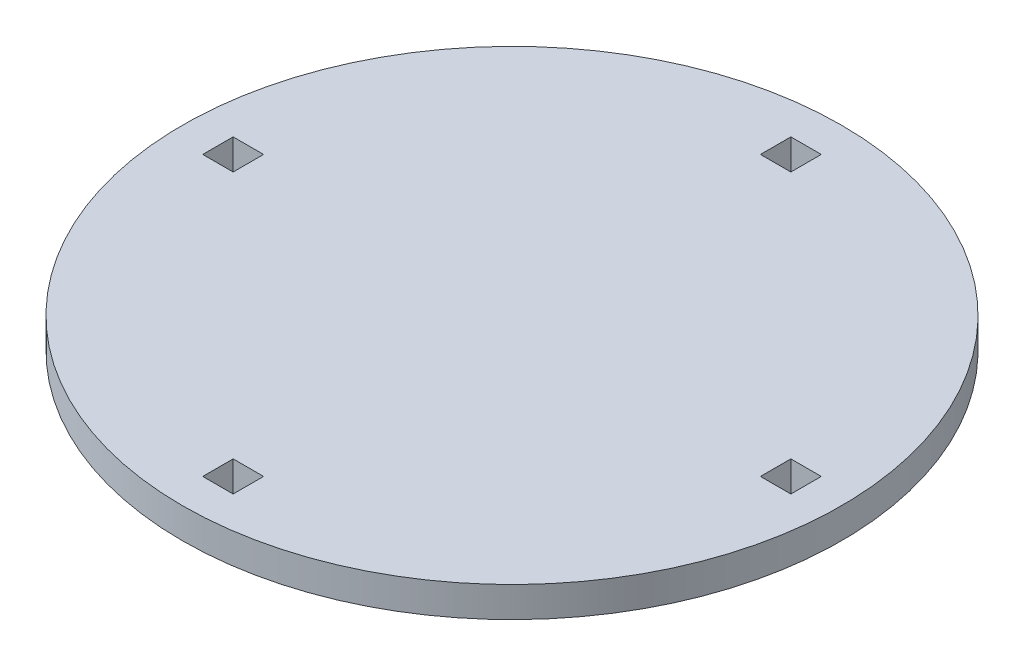
ISO-10303-21;
HEADER;
FILE_DESCRIPTION(('STEP AP214'),'2;1');
FILE_NAME('part.step','',(''),(''),'','','');
FILE_SCHEMA(('AUTOMOTIVE_DESIGN { 1 0 10303 214 1 1 1 1 }'));
ENDSEC;
DATA;
#1=APPLICATION_CONTEXT('core data for automotive mechanical design processes');
#2=APPLICATION_PROTOCOL_DEFINITION('international standard','automotive_design',2000,#1);
#3=PRODUCT_CONTEXT('',#1,'mechanical');
#4=PRODUCT('Part','Part','',(#3));
#5=PRODUCT_RELATED_PRODUCT_CATEGORY('part','',(#4));
#6=PRODUCT_DEFINITION_FORMATION('','',#4);
#7=PRODUCT_DEFINITION_CONTEXT('part definition',#1,'design');
#8=PRODUCT_DEFINITION('design','',#6,#7);
#9=PRODUCT_DEFINITION_SHAPE('','',#8);
#10=(LENGTH_UNIT() NAMED_UNIT(*) SI_UNIT(.MILLI.,.METRE.));
#11=(NAMED_UNIT(*) PLANE_ANGLE_UNIT() SI_UNIT($,.RADIAN.));
#12=(NAMED_UNIT(*) SI_UNIT($,.STERADIAN.) SOLID_ANGLE_UNIT());
#13=UNCERTAINTY_MEASURE_WITH_UNIT(LENGTH_MEASURE(1.E-05),#10,'distance_accuracy_value','');
#14=(GEOMETRIC_REPRESENTATION_CONTEXT(3) GLOBAL_UNCERTAINTY_ASSIGNED_CONTEXT((#13)) GLOBAL_UNIT_ASSIGNED_CONTEXT((#10,
#11,#12)) REPRESENTATION_CONTEXT('',''));
#15=CARTESIAN_POINT('',(0.,0.,0.));
#16=DIRECTION('',(0.,0.,1.));
#17=DIRECTION('',(1.,0.,0.));
#18=AXIS2_PLACEMENT_3D('',#15,#16,#17);
#19=CARTESIAN_POINT('',(0.,3.,0.));
#20=DIRECTION('',(0.,1.,0.));
#21=DIRECTION('',(0.,0.,1.));
#22=AXIS2_PLACEMENT_3D('',#19,#20,#21);
#23=PLANE('',#22);
#24=CARTESIAN_POINT('',(0.,3.,0.));
#25=DIRECTION('',(0.,1.,0.));
#26=DIRECTION('',(0.,0.,1.));
#27=AXIS2_PLACEMENT_3D('',#24,#25,#26);
#28=CIRCLE('',#27,32.5);
#29=CARTESIAN_POINT('',(0.,3.,32.5));
#30=VERTEX_POINT('',#29);
#31=EDGE_CURVE('E11',#30,#30,#28,.T.);
#32=ORIENTED_EDGE('',*,*,#31,.T.);
#33=EDGE_LOOP('',(#32));
#34=FACE_BOUND('',#33,.T.);
#35=DIRECTION('',(0.,0.,-1.));
#36=VECTOR('',#35,1.);
#37=CARTESIAN_POINT('',(-28.9999999999969,3.,0.));
#38=LINE('',#37,#36);
#39=CARTESIAN_POINT('',(-28.9999999999969,3.,1.5000000000028));
#40=VERTEX_POINT('',#39);
#41=CARTESIAN_POINT('',(-28.9999999999969,3.,-1.4999999999972));
#42=VERTEX_POINT('',#41);
#43=EDGE_CURVE('E287',#40,#42,#38,.T.);
#44=ORIENTED_EDGE('',*,*,#43,.T.);
#45=DIRECTION('',(1.,0.,0.));
#46=VECTOR('',#45,1.);
#47=CARTESIAN_POINT('',(0.,3.,-1.49999999999721));
#48=LINE('',#47,#46);
#49=CARTESIAN_POINT('',(-25.9999999999969,3.,-1.4999999999972));
#50=VERTEX_POINT('',#49);
#51=EDGE_CURVE('E291',#42,#50,#48,.T.);
#52=ORIENTED_EDGE('',*,*,#51,.T.);
#53=DIRECTION('',(0.,0.,1.));
#54=VECTOR('',#53,1.);
#55=CARTESIAN_POINT('',(-25.9999999999969,3.,0.));
#56=LINE('',#55,#54);
#57=CARTESIAN_POINT('',(-25.9999999999969,3.,1.5000000000028));
#58=VERTEX_POINT('',#57);
#59=EDGE_CURVE('E164',#50,#58,#56,.T.);
#60=ORIENTED_EDGE('',*,*,#59,.T.);
#61=DIRECTION('',(-1.,0.,0.));
#62=VECTOR('',#61,1.);
#63=CARTESIAN_POINT('',(0.,3.,1.50000000000279));
#64=LINE('',#63,#62);
#65=EDGE_CURVE('E283',#58,#40,#64,.T.);
#66=ORIENTED_EDGE('',*,*,#65,.T.);
#67=EDGE_LOOP('',(#44,#52,#60,#66));
#68=FACE_BOUND('',#67,.T.);
#69=DIRECTION('',(-1.,0.,0.));
#70=VECTOR('',#69,1.);
#71=CARTESIAN_POINT('',(0.,3.,28.9999999999997));
#72=LINE('',#71,#70);
#73=CARTESIAN_POINT('',(1.50000000000591,3.,28.9999999999997));
#74=VERTEX_POINT('',#73);
#75=CARTESIAN_POINT('',(-1.49999999999409,3.,28.9999999999997));
#76=VERTEX_POINT('',#75);
#77=EDGE_CURVE('E303',#74,#76,#72,.T.);
#78=ORIENTED_EDGE('',*,*,#77,.T.);
#79=DIRECTION('',(0.,0.,-1.));
#80=VECTOR('',#79,1.);
#81=CARTESIAN_POINT('',(-1.49999999999409,3.,0.));
#82=LINE('',#81,#80);
#83=CARTESIAN_POINT('',(-1.49999999999409,3.,25.9999999999997));
#84=VERTEX_POINT('',#83);
#85=EDGE_CURVE('E307',#76,#84,#82,.T.);
#86=ORIENTED_EDGE('',*,*,#85,.T.);
#87=DIRECTION('',(1.,0.,0.));
#88=VECTOR('',#87,1.);
#89=CARTESIAN_POINT('',(0.,3.,25.9999999999997));
#90=LINE('',#89,#88);
#91=CARTESIAN_POINT('',(1.50000000000591,3.,25.9999999999997));
#92=VERTEX_POINT('',#91);
#93=EDGE_CURVE('E295',#84,#92,#90,.T.);
#94=ORIENTED_EDGE('',*,*,#93,.T.);
#95=DIRECTION('',(0.,0.,1.));
#96=VECTOR('',#95,1.);
#97=CARTESIAN_POINT('',(1.50000000000591,3.,0.));
#98=LINE('',#97,#96);
#99=EDGE_CURVE('E299',#92,#74,#98,.T.);
#100=ORIENTED_EDGE('',*,*,#99,.T.);
#101=EDGE_LOOP('',(#78,#86,#94,#100));
#102=FACE_BOUND('',#101,.T.);
#103=DIRECTION('',(0.,0.,1.));
#104=VECTOR('',#103,1.);
#105=CARTESIAN_POINT('',(29.0000000000028,3.,0.));
#106=LINE('',#105,#104);
#107=CARTESIAN_POINT('',(29.0000000000028,3.,-1.50000000000312));
#108=VERTEX_POINT('',#107);
#109=CARTESIAN_POINT('',(29.0000000000028,3.,1.49999999999688));
#110=VERTEX_POINT('',#109);
#111=EDGE_CURVE('E319',#108,#110,#106,.T.);
#112=ORIENTED_EDGE('',*,*,#111,.T.);
#113=DIRECTION('',(-1.,0.,0.));
#114=VECTOR('',#113,1.);
#115=CARTESIAN_POINT('',(0.,3.,1.49999999999689));
#116=LINE('',#115,#114);
#117=CARTESIAN_POINT('',(26.0000000000028,3.,1.49999999999688));
#118=VERTEX_POINT('',#117);
#119=EDGE_CURVE('E323',#110,#118,#116,.T.);
#120=ORIENTED_EDGE('',*,*,#119,.T.);
#121=DIRECTION('',(0.,0.,-1.));
#122=VECTOR('',#121,1.);
#123=CARTESIAN_POINT('',(26.0000000000028,3.,0.));
#124=LINE('',#123,#122);
#125=CARTESIAN_POINT('',(26.0000000000028,3.,-1.50000000000312));
#126=VERTEX_POINT('',#125);
#127=EDGE_CURVE('E311',#118,#126,#124,.T.);
#128=ORIENTED_EDGE('',*,*,#127,.T.);
#129=DIRECTION('',(1.,0.,0.));
#130=VECTOR('',#129,1.);
#131=CARTESIAN_POINT('',(0.,3.,-1.50000000000311));
#132=LINE('',#131,#130);
#133=EDGE_CURVE('E315',#126,#108,#132,.T.);
#134=ORIENTED_EDGE('',*,*,#133,.T.);
#135=EDGE_LOOP('',(#112,#120,#128,#134));
#136=FACE_BOUND('',#135,.T.);
#137=DIRECTION('',(1.,0.,0.));
#138=VECTOR('',#137,1.);
#139=CARTESIAN_POINT('',(0.,3.,-29.));
#140=LINE('',#139,#138);
#141=CARTESIAN_POINT('',(-1.5,3.,-29.));
#142=VERTEX_POINT('',#141);
#143=CARTESIAN_POINT('',(1.5,3.,-29.));
#144=VERTEX_POINT('',#143);
#145=EDGE_CURVE('E335',#142,#144,#140,.T.);
#146=ORIENTED_EDGE('',*,*,#145,.T.);
#147=DIRECTION('',(0.,0.,1.));
#148=VECTOR('',#147,1.);
#149=CARTESIAN_POINT('',(1.5,3.,0.));
#150=LINE('',#149,#148);
#151=CARTESIAN_POINT('',(1.5,3.,-26.));
#152=VERTEX_POINT('',#151);
#153=EDGE_CURVE('E160',#144,#152,#150,.T.);
#154=ORIENTED_EDGE('',*,*,#153,.T.);
#155=DIRECTION('',(-1.,0.,0.));
#156=VECTOR('',#155,1.);
#157=CARTESIAN_POINT('',(0.,3.,-26.));
#158=LINE('',#157,#156);
#159=CARTESIAN_POINT('',(-1.5,3.,-26.));
#160=VERTEX_POINT('',#159);
#161=EDGE_CURVE('E327',#152,#160,#158,.T.);
#162=ORIENTED_EDGE('',*,*,#161,.T.);
#163=DIRECTION('',(0.,0.,-1.));
#164=VECTOR('',#163,1.);
#165=CARTESIAN_POINT('',(-1.5,3.,0.));
#166=LINE('',#165,#164);
#167=EDGE_CURVE('E331',#160,#142,#166,.T.);
#168=ORIENTED_EDGE('',*,*,#167,.T.);
#169=EDGE_LOOP('',(#146,#154,#162,#168));
#170=FACE_BOUND('',#169,.T.);
#171=ADVANCED_FACE('F39',(#34,#68,#102,#136,#170),#23,.T.);
#172=CARTESIAN_POINT('',(0.,0.,0.));
#173=DIRECTION('',(0.,1.,0.));
#174=DIRECTION('',(0.,0.,1.));
#175=AXIS2_PLACEMENT_3D('',#172,#173,#174);
#176=PLANE('',#175);
#177=DIRECTION('',(1.,0.,0.));
#178=VECTOR('',#177,1.);
#179=CARTESIAN_POINT('',(26.0000000000028,0.,1.49999999999688));
#180=LINE('',#179,#178);
#181=CARTESIAN_POINT('',(26.0000000000028,0.,1.49999999999688));
#182=VERTEX_POINT('',#181);
#183=CARTESIAN_POINT('',(29.0000000000028,0.,1.49999999999688));
#184=VERTEX_POINT('',#183);
#185=EDGE_CURVE('E198',#182,#184,#180,.T.);
#186=ORIENTED_EDGE('',*,*,#185,.T.);
#187=DIRECTION('',(0.,0.,-1.));
#188=VECTOR('',#187,1.);
#189=CARTESIAN_POINT('',(29.0000000000028,0.,-1.50000000000312));
#190=LINE('',#189,#188);
#191=CARTESIAN_POINT('',(29.0000000000028,0.,-1.50000000000312));
#192=VERTEX_POINT('',#191);
#193=EDGE_CURVE('E202',#184,#192,#190,.T.);
#194=ORIENTED_EDGE('',*,*,#193,.T.);
#195=DIRECTION('',(-1.,0.,0.));
#196=VECTOR('',#195,1.);
#197=CARTESIAN_POINT('',(26.0000000000028,0.,-1.50000000000312));
#198=LINE('',#197,#196);
#199=CARTESIAN_POINT('',(26.0000000000028,0.,-1.50000000000312));
#200=VERTEX_POINT('',#199);
#201=EDGE_CURVE('E207',#192,#200,#198,.T.);
#202=ORIENTED_EDGE('',*,*,#201,.T.);
#203=DIRECTION('',(0.,0.,1.));
#204=VECTOR('',#203,1.);
#205=CARTESIAN_POINT('',(26.0000000000028,0.,-1.50000000000312));
#206=LINE('',#205,#204);
#207=EDGE_CURVE('E211',#200,#182,#206,.T.);
#208=ORIENTED_EDGE('',*,*,#207,.T.);
#209=EDGE_LOOP('',(#186,#194,#202,#208));
#210=FACE_BOUND('',#209,.T.);
#211=DIRECTION('',(-1.,0.,0.));
#212=VECTOR('',#211,1.);
#213=CARTESIAN_POINT('',(-25.9999999999969,0.,-1.4999999999972));
#214=LINE('',#213,#212);
#215=CARTESIAN_POINT('',(-25.9999999999969,0.,-1.4999999999972));
#216=VERTEX_POINT('',#215);
#217=CARTESIAN_POINT('',(-28.9999999999969,0.,-1.4999999999972));
#218=VERTEX_POINT('',#217);
#219=EDGE_CURVE('E252',#216,#218,#214,.T.);
#220=ORIENTED_EDGE('',*,*,#219,.T.);
#221=DIRECTION('',(0.,0.,1.));
#222=VECTOR('',#221,1.);
#223=CARTESIAN_POINT('',(-28.9999999999969,0.,1.5000000000028));
#224=LINE('',#223,#222);
#225=CARTESIAN_POINT('',(-28.9999999999969,0.,1.5000000000028));
#226=VERTEX_POINT('',#225);
#227=EDGE_CURVE('E256',#218,#226,#224,.T.);
#228=ORIENTED_EDGE('',*,*,#227,.T.);
#229=DIRECTION('',(1.,0.,0.));
#230=VECTOR('',#229,1.);
#231=CARTESIAN_POINT('',(-25.9999999999969,0.,1.5000000000028));
#232=LINE('',#231,#230);
#233=CARTESIAN_POINT('',(-25.9999999999969,0.,1.5000000000028));
#234=VERTEX_POINT('',#233);
#235=EDGE_CURVE('E260',#226,#234,#232,.T.);
#236=ORIENTED_EDGE('',*,*,#235,.T.);
#237=DIRECTION('',(0.,0.,-1.));
#238=VECTOR('',#237,1.);
#239=CARTESIAN_POINT('',(-25.9999999999969,0.,1.5000000000028));
#240=LINE('',#239,#238);
#241=EDGE_CURVE('E264',#234,#216,#240,.T.);
#242=ORIENTED_EDGE('',*,*,#241,.T.);
#243=EDGE_LOOP('',(#220,#228,#236,#242));
#244=FACE_BOUND('',#243,.T.);
#245=CARTESIAN_POINT('',(0.,0.,0.));
#246=DIRECTION('',(0.,1.,0.));
#247=DIRECTION('',(0.,0.,1.));
#248=AXIS2_PLACEMENT_3D('',#245,#246,#247);
#249=CIRCLE('',#248,32.5);
#250=CARTESIAN_POINT('',(0.,0.,32.5));
#251=VERTEX_POINT('',#250);
#252=EDGE_CURVE('E43',#251,#251,#249,.T.);
#253=ORIENTED_EDGE('',*,*,#252,.F.);
#254=EDGE_LOOP('',(#253));
#255=FACE_BOUND('',#254,.T.);
#256=DIRECTION('',(0.,0.,1.));
#257=VECTOR('',#256,1.);
#258=CARTESIAN_POINT('',(-1.49999999999409,0.,25.9999999999997));
#259=LINE('',#258,#257);
#260=CARTESIAN_POINT('',(-1.49999999999409,0.,25.9999999999997));
#261=VERTEX_POINT('',#260);
#262=CARTESIAN_POINT('',(-1.49999999999409,0.,28.9999999999997));
#263=VERTEX_POINT('',#262);
#264=EDGE_CURVE('E223',#261,#263,#259,.T.);
#265=ORIENTED_EDGE('',*,*,#264,.T.);
#266=DIRECTION('',(1.,0.,0.));
#267=VECTOR('',#266,1.);
#268=CARTESIAN_POINT('',(1.50000000000591,0.,28.9999999999997));
#269=LINE('',#268,#267);
#270=CARTESIAN_POINT('',(1.50000000000591,0.,28.9999999999997));
#271=VERTEX_POINT('',#270);
#272=EDGE_CURVE('E227',#263,#271,#269,.T.);
#273=ORIENTED_EDGE('',*,*,#272,.T.);
#274=DIRECTION('',(0.,0.,-1.));
#275=VECTOR('',#274,1.);
#276=CARTESIAN_POINT('',(1.50000000000591,0.,25.9999999999997));
#277=LINE('',#276,#275);
#278=CARTESIAN_POINT('',(1.50000000000591,0.,25.9999999999997));
#279=VERTEX_POINT('',#278);
#280=EDGE_CURVE('E232',#271,#279,#277,.T.);
#281=ORIENTED_EDGE('',*,*,#280,.T.);
#282=DIRECTION('',(-1.,0.,0.));
#283=VECTOR('',#282,1.);
#284=CARTESIAN_POINT('',(1.50000000000591,0.,25.9999999999997));
#285=LINE('',#284,#283);
#286=EDGE_CURVE('E236',#279,#261,#285,.T.);
#287=ORIENTED_EDGE('',*,*,#286,.T.);
#288=EDGE_LOOP('',(#265,#273,#281,#287));
#289=FACE_BOUND('',#288,.T.);
#290=DIRECTION('',(0.,0.,-1.));
#291=VECTOR('',#290,1.);
#292=CARTESIAN_POINT('',(1.5,0.,-26.));
#293=LINE('',#292,#291);
#294=CARTESIAN_POINT('',(1.5,0.,-26.));
#295=VERTEX_POINT('',#294);
#296=CARTESIAN_POINT('',(1.5,0.,-29.));
#297=VERTEX_POINT('',#296);
#298=EDGE_CURVE('E157',#295,#297,#293,.T.);
#299=ORIENTED_EDGE('',*,*,#298,.T.);
#300=DIRECTION('',(-1.,0.,0.));
#301=VECTOR('',#300,1.);
#302=CARTESIAN_POINT('',(-1.5,0.,-29.));
#303=LINE('',#302,#301);
#304=CARTESIAN_POINT('',(-1.5,0.,-29.));
#305=VERTEX_POINT('',#304);
#306=EDGE_CURVE('E168',#297,#305,#303,.T.);
#307=ORIENTED_EDGE('',*,*,#306,.T.);
#308=DIRECTION('',(0.,0.,1.));
#309=VECTOR('',#308,1.);
#310=CARTESIAN_POINT('',(-1.5,0.,-26.));
#311=LINE('',#310,#309);
#312=CARTESIAN_POINT('',(-1.5,0.,-26.));
#313=VERTEX_POINT('',#312);
#314=EDGE_CURVE('E175',#305,#313,#311,.T.);
#315=ORIENTED_EDGE('',*,*,#314,.T.);
#316=DIRECTION('',(1.,0.,0.));
#317=VECTOR('',#316,1.);
#318=CARTESIAN_POINT('',(-1.5,0.,-26.));
#319=LINE('',#318,#317);
#320=EDGE_CURVE('E179',#313,#295,#319,.T.);
#321=ORIENTED_EDGE('',*,*,#320,.T.);
#322=EDGE_LOOP('',(#299,#307,#315,#321));
#323=FACE_BOUND('',#322,.T.);
#324=ADVANCED_FACE('F178',(#210,#244,#255,#289,#323),#176,.F.);
#325=CARTESIAN_POINT('',(0.,3.,0.));
#326=DIRECTION('',(0.,-1.,0.));
#327=DIRECTION('',(0.,0.,-1.));
#328=AXIS2_PLACEMENT_3D('',#325,#326,#327);
#329=CYLINDRICAL_SURFACE('',#328,32.5);
#330=ORIENTED_EDGE('',*,*,#31,.F.);
#331=EDGE_LOOP('',(#330));
#332=FACE_BOUND('',#331,.T.);
#333=ORIENTED_EDGE('',*,*,#252,.T.);
#334=EDGE_LOOP('',(#333));
#335=FACE_BOUND('',#334,.T.);
#336=ADVANCED_FACE('F41',(#332,#335),#329,.T.);
#337=CARTESIAN_POINT('',(-25.9999999999969,10.,-1.4999999999972));
#338=DIRECTION('',(0.,0.,1.));
#339=DIRECTION('',(1.,0.,0.));
#340=AXIS2_PLACEMENT_3D('',#337,#338,#339);
#341=PLANE('',#340);
#342=DIRECTION('',(0.,-1.,0.));
#343=VECTOR('',#342,1.);
#344=CARTESIAN_POINT('',(-28.9999999999969,10.,-1.4999999999972));
#345=LINE('',#344,#343);
#346=EDGE_CURVE('E228',#42,#218,#345,.T.);
#347=ORIENTED_EDGE('',*,*,#346,.T.);
#348=ORIENTED_EDGE('',*,*,#219,.F.);
#349=DIRECTION('',(0.,-1.,0.));
#350=VECTOR('',#349,1.);
#351=CARTESIAN_POINT('',(-25.9999999999969,10.,-1.4999999999972));
#352=LINE('',#351,#350);
#353=EDGE_CURVE('E268',#50,#216,#352,.T.);
#354=ORIENTED_EDGE('',*,*,#353,.F.);
#355=ORIENTED_EDGE('',*,*,#51,.F.);
#356=EDGE_LOOP('',(#347,#348,#354,#355));
#357=FACE_BOUND('',#356,.T.);
#358=ADVANCED_FACE('F381',(#357),#341,.T.);
#359=CARTESIAN_POINT('',(-28.9999999999969,10.,1.5000000000028));
#360=DIRECTION('',(1.,0.,0.));
#361=DIRECTION('',(0.,0.,-1.));
#362=AXIS2_PLACEMENT_3D('',#359,#360,#361);
#363=PLANE('',#362);
#364=DIRECTION('',(0.,-1.,0.));
#365=VECTOR('',#364,1.);
#366=CARTESIAN_POINT('',(-28.9999999999969,10.,1.5000000000028));
#367=LINE('',#366,#365);
#368=EDGE_CURVE('E275',#40,#226,#367,.T.);
#369=ORIENTED_EDGE('',*,*,#368,.T.);
#370=ORIENTED_EDGE('',*,*,#227,.F.);
#371=ORIENTED_EDGE('',*,*,#346,.F.);
#372=ORIENTED_EDGE('',*,*,#43,.F.);
#373=EDGE_LOOP('',(#369,#370,#371,#372));
#374=FACE_BOUND('',#373,.T.);
#375=ADVANCED_FACE('F384',(#374),#363,.T.);
#376=CARTESIAN_POINT('',(-25.9999999999969,10.,1.5000000000028));
#377=DIRECTION('',(0.,0.,-1.));
#378=DIRECTION('',(-1.,0.,0.));
#379=AXIS2_PLACEMENT_3D('',#376,#377,#378);
#380=PLANE('',#379);
#381=DIRECTION('',(0.,-1.,0.));
#382=VECTOR('',#381,1.);
#383=CARTESIAN_POINT('',(-25.9999999999969,10.,1.5000000000028));
#384=LINE('',#383,#382);
#385=EDGE_CURVE('E272',#58,#234,#384,.T.);
#386=ORIENTED_EDGE('',*,*,#385,.T.);
#387=ORIENTED_EDGE('',*,*,#235,.F.);
#388=ORIENTED_EDGE('',*,*,#368,.F.);
#389=ORIENTED_EDGE('',*,*,#65,.F.);
#390=EDGE_LOOP('',(#386,#387,#388,#389));
#391=FACE_BOUND('',#390,.T.);
#392=ADVANCED_FACE('F388',(#391),#380,.T.);
#393=CARTESIAN_POINT('',(-25.9999999999969,10.,1.5000000000028));
#394=DIRECTION('',(-1.,0.,0.));
#395=DIRECTION('',(0.,0.,1.));
#396=AXIS2_PLACEMENT_3D('',#393,#394,#395);
#397=PLANE('',#396);
#398=ORIENTED_EDGE('',*,*,#353,.T.);
#399=ORIENTED_EDGE('',*,*,#241,.F.);
#400=ORIENTED_EDGE('',*,*,#385,.F.);
#401=ORIENTED_EDGE('',*,*,#59,.F.);
#402=EDGE_LOOP('',(#398,#399,#400,#401));
#403=FACE_BOUND('',#402,.T.);
#404=ADVANCED_FACE('F392',(#403),#397,.T.);
#405=CARTESIAN_POINT('',(-1.49999999999409,10.,25.9999999999997));
#406=DIRECTION('',(1.,0.,0.));
#407=DIRECTION('',(0.,0.,-1.));
#408=AXIS2_PLACEMENT_3D('',#405,#406,#407);
#409=PLANE('',#408);
#410=DIRECTION('',(0.,-1.,0.));
#411=VECTOR('',#410,1.);
#412=CARTESIAN_POINT('',(-1.49999999999409,10.,28.9999999999997));
#413=LINE('',#412,#411);
#414=EDGE_CURVE('E203',#76,#263,#413,.T.);
#415=ORIENTED_EDGE('',*,*,#414,.T.);
#416=ORIENTED_EDGE('',*,*,#264,.F.);
#417=DIRECTION('',(0.,-1.,0.));
#418=VECTOR('',#417,1.);
#419=CARTESIAN_POINT('',(-1.49999999999409,10.,25.9999999999997));
#420=LINE('',#419,#418);
#421=EDGE_CURVE('E240',#84,#261,#420,.T.);
#422=ORIENTED_EDGE('',*,*,#421,.F.);
#423=ORIENTED_EDGE('',*,*,#85,.F.);
#424=EDGE_LOOP('',(#415,#416,#422,#423));
#425=FACE_BOUND('',#424,.T.);
#426=ADVANCED_FACE('F352',(#425),#409,.T.);
#427=CARTESIAN_POINT('',(1.50000000000591,10.,28.9999999999997));
#428=DIRECTION('',(0.,0.,-1.));
#429=DIRECTION('',(-1.,0.,0.));
#430=AXIS2_PLACEMENT_3D('',#427,#428,#429);
#431=PLANE('',#430);
#432=DIRECTION('',(0.,-1.,0.));
#433=VECTOR('',#432,1.);
#434=CARTESIAN_POINT('',(1.50000000000591,10.,28.9999999999997));
#435=LINE('',#434,#433);
#436=EDGE_CURVE('E247',#74,#271,#435,.T.);
#437=ORIENTED_EDGE('',*,*,#436,.T.);
#438=ORIENTED_EDGE('',*,*,#272,.F.);
#439=ORIENTED_EDGE('',*,*,#414,.F.);
#440=ORIENTED_EDGE('',*,*,#77,.F.);
#441=EDGE_LOOP('',(#437,#438,#439,#440));
#442=FACE_BOUND('',#441,.T.);
#443=ADVANCED_FACE('F360',(#442),#431,.T.);
#444=CARTESIAN_POINT('',(1.50000000000591,10.,25.9999999999997));
#445=DIRECTION('',(-1.,0.,0.));
#446=DIRECTION('',(0.,0.,1.));
#447=AXIS2_PLACEMENT_3D('',#444,#445,#446);
#448=PLANE('',#447);
#449=DIRECTION('',(0.,-1.,0.));
#450=VECTOR('',#449,1.);
#451=CARTESIAN_POINT('',(1.50000000000591,10.,25.9999999999997));
#452=LINE('',#451,#450);
#453=EDGE_CURVE('E244',#92,#279,#452,.T.);
#454=ORIENTED_EDGE('',*,*,#453,.T.);
#455=ORIENTED_EDGE('',*,*,#280,.F.);
#456=ORIENTED_EDGE('',*,*,#436,.F.);
#457=ORIENTED_EDGE('',*,*,#99,.F.);
#458=EDGE_LOOP('',(#454,#455,#456,#457));
#459=FACE_BOUND('',#458,.T.);
#460=ADVANCED_FACE('F364',(#459),#448,.T.);
#461=CARTESIAN_POINT('',(1.50000000000591,10.,25.9999999999997));
#462=DIRECTION('',(0.,0.,1.));
#463=DIRECTION('',(1.,0.,0.));
#464=AXIS2_PLACEMENT_3D('',#461,#462,#463);
#465=PLANE('',#464);
#466=ORIENTED_EDGE('',*,*,#421,.T.);
#467=ORIENTED_EDGE('',*,*,#286,.F.);
#468=ORIENTED_EDGE('',*,*,#453,.F.);
#469=ORIENTED_EDGE('',*,*,#93,.F.);
#470=EDGE_LOOP('',(#466,#467,#468,#469));
#471=FACE_BOUND('',#470,.T.);
#472=ADVANCED_FACE('F355',(#471),#465,.T.);
#473=CARTESIAN_POINT('',(26.0000000000028,10.,1.49999999999688));
#474=DIRECTION('',(0.,0.,-1.));
#475=DIRECTION('',(-1.,0.,0.));
#476=AXIS2_PLACEMENT_3D('',#473,#474,#475);
#477=PLANE('',#476);
#478=DIRECTION('',(0.,-1.,0.));
#479=VECTOR('',#478,1.);
#480=CARTESIAN_POINT('',(29.0000000000028,10.,1.49999999999688));
#481=LINE('',#480,#479);
#482=EDGE_CURVE('E181',#110,#184,#481,.T.);
#483=ORIENTED_EDGE('',*,*,#482,.T.);
#484=ORIENTED_EDGE('',*,*,#185,.F.);
#485=DIRECTION('',(0.,-1.,0.));
#486=VECTOR('',#485,1.);
#487=CARTESIAN_POINT('',(26.0000000000028,10.,1.49999999999688));
#488=LINE('',#487,#486);
#489=EDGE_CURVE('E215',#118,#182,#488,.T.);
#490=ORIENTED_EDGE('',*,*,#489,.F.);
#491=ORIENTED_EDGE('',*,*,#119,.F.);
#492=EDGE_LOOP('',(#483,#484,#490,#491));
#493=FACE_BOUND('',#492,.T.);
#494=ADVANCED_FACE('F371',(#493),#477,.T.);
#495=CARTESIAN_POINT('',(29.0000000000028,10.,-1.50000000000312));
#496=DIRECTION('',(-1.,0.,0.));
#497=DIRECTION('',(0.,0.,1.));
#498=AXIS2_PLACEMENT_3D('',#495,#496,#497);
#499=PLANE('',#498);
#500=DIRECTION('',(0.,-1.,0.));
#501=VECTOR('',#500,1.);
#502=CARTESIAN_POINT('',(29.0000000000028,10.,-1.50000000000312));
#503=LINE('',#502,#501);
#504=EDGE_CURVE('E184',#108,#192,#503,.T.);
#505=ORIENTED_EDGE('',*,*,#504,.T.);
#506=ORIENTED_EDGE('',*,*,#193,.F.);
#507=ORIENTED_EDGE('',*,*,#482,.F.);
#508=ORIENTED_EDGE('',*,*,#111,.F.);
#509=EDGE_LOOP('',(#505,#506,#507,#508));
#510=FACE_BOUND('',#509,.T.);
#511=ADVANCED_FACE('F425',(#510),#499,.T.);
#512=CARTESIAN_POINT('',(26.0000000000028,10.,-1.50000000000312));
#513=DIRECTION('',(0.,0.,1.));
#514=DIRECTION('',(1.,0.,0.));
#515=AXIS2_PLACEMENT_3D('',#512,#513,#514);
#516=PLANE('',#515);
#517=DIRECTION('',(0.,-1.,0.));
#518=VECTOR('',#517,1.);
#519=CARTESIAN_POINT('',(26.0000000000028,10.,-1.50000000000312));
#520=LINE('',#519,#518);
#521=EDGE_CURVE('E63',#126,#200,#520,.T.);
#522=ORIENTED_EDGE('',*,*,#521,.T.);
#523=ORIENTED_EDGE('',*,*,#201,.F.);
#524=ORIENTED_EDGE('',*,*,#504,.F.);
#525=ORIENTED_EDGE('',*,*,#133,.F.);
#526=EDGE_LOOP('',(#522,#523,#524,#525));
#527=FACE_BOUND('',#526,.T.);
#528=ADVANCED_FACE('F435',(#527),#516,.T.);
#529=CARTESIAN_POINT('',(26.0000000000028,10.,-1.50000000000312));
#530=DIRECTION('',(1.,0.,0.));
#531=DIRECTION('',(0.,0.,-1.));
#532=AXIS2_PLACEMENT_3D('',#529,#530,#531);
#533=PLANE('',#532);
#534=ORIENTED_EDGE('',*,*,#489,.T.);
#535=ORIENTED_EDGE('',*,*,#207,.F.);
#536=ORIENTED_EDGE('',*,*,#521,.F.);
#537=ORIENTED_EDGE('',*,*,#127,.F.);
#538=EDGE_LOOP('',(#534,#535,#536,#537));
#539=FACE_BOUND('',#538,.T.);
#540=ADVANCED_FACE('F445',(#539),#533,.T.);
#541=CARTESIAN_POINT('',(1.5,10.,-26.));
#542=DIRECTION('',(-1.,0.,0.));
#543=DIRECTION('',(0.,0.,1.));
#544=AXIS2_PLACEMENT_3D('',#541,#542,#543);
#545=PLANE('',#544);
#546=DIRECTION('',(0.,-1.,0.));
#547=VECTOR('',#546,1.);
#548=CARTESIAN_POINT('',(1.5,10.,-29.));
#549=LINE('',#548,#547);
#550=EDGE_CURVE('E152',#144,#297,#549,.T.);
#551=ORIENTED_EDGE('',*,*,#550,.T.);
#552=ORIENTED_EDGE('',*,*,#298,.F.);
#553=DIRECTION('',(0.,-1.,0.));
#554=VECTOR('',#553,1.);
#555=CARTESIAN_POINT('',(1.5,10.,-26.));
#556=LINE('',#555,#554);
#557=EDGE_CURVE('E191',#152,#295,#556,.T.);
#558=ORIENTED_EDGE('',*,*,#557,.F.);
#559=ORIENTED_EDGE('',*,*,#153,.F.);
#560=EDGE_LOOP('',(#551,#552,#558,#559));
#561=FACE_BOUND('',#560,.T.);
#562=ADVANCED_FACE('F154',(#561),#545,.T.);
#563=CARTESIAN_POINT('',(-1.5,10.,-29.));
#564=DIRECTION('',(0.,0.,1.));
#565=DIRECTION('',(1.,0.,0.));
#566=AXIS2_PLACEMENT_3D('',#563,#564,#565);
#567=PLANE('',#566);
#568=DIRECTION('',(0.,-1.,0.));
#569=VECTOR('',#568,1.);
#570=CARTESIAN_POINT('',(-1.5,10.,-29.));
#571=LINE('',#570,#569);
#572=EDGE_CURVE('E165',#142,#305,#571,.T.);
#573=ORIENTED_EDGE('',*,*,#572,.T.);
#574=ORIENTED_EDGE('',*,*,#306,.F.);
#575=ORIENTED_EDGE('',*,*,#550,.F.);
#576=ORIENTED_EDGE('',*,*,#145,.F.);
#577=EDGE_LOOP('',(#573,#574,#575,#576));
#578=FACE_BOUND('',#577,.T.);
#579=ADVANCED_FACE('F169',(#578),#567,.T.);
#580=CARTESIAN_POINT('',(-1.5,10.,-26.));
#581=DIRECTION('',(1.,0.,0.));
#582=DIRECTION('',(0.,0.,-1.));
#583=AXIS2_PLACEMENT_3D('',#580,#581,#582);
#584=PLANE('',#583);
#585=DIRECTION('',(0.,-1.,0.));
#586=VECTOR('',#585,1.);
#587=CARTESIAN_POINT('',(-1.5,10.,-26.));
#588=LINE('',#587,#586);
#589=EDGE_CURVE('E55',#160,#313,#588,.T.);
#590=ORIENTED_EDGE('',*,*,#589,.T.);
#591=ORIENTED_EDGE('',*,*,#314,.F.);
#592=ORIENTED_EDGE('',*,*,#572,.F.);
#593=ORIENTED_EDGE('',*,*,#167,.F.);
#594=EDGE_LOOP('',(#590,#591,#592,#593));
#595=FACE_BOUND('',#594,.T.);
#596=ADVANCED_FACE('F471',(#595),#584,.T.);
#597=CARTESIAN_POINT('',(-1.5,10.,-26.));
#598=DIRECTION('',(0.,0.,-1.));
#599=DIRECTION('',(-1.,0.,0.));
#600=AXIS2_PLACEMENT_3D('',#597,#598,#599);
#601=PLANE('',#600);
#602=ORIENTED_EDGE('',*,*,#557,.T.);
#603=ORIENTED_EDGE('',*,*,#320,.F.);
#604=ORIENTED_EDGE('',*,*,#589,.F.);
#605=ORIENTED_EDGE('',*,*,#161,.F.);
#606=EDGE_LOOP('',(#602,#603,#604,#605));
#607=FACE_BOUND('',#606,.T.);
#608=ADVANCED_FACE('F480',(#607),#601,.T.);
#609=CLOSED_SHELL('',(#171,#324,#336,#358,#375,#392,#404,#426,#443,#460,#472,#494,#511,#528,
#540,#562,#579,#596,#608));
#610=MANIFOLD_SOLID_BREP('B2',#609);
#611=ADVANCED_BREP_SHAPE_REPRESENTATION('',(#18,#610),#14);
#612=SHAPE_DEFINITION_REPRESENTATION(#9,#611);
ENDSEC;
END-ISO-10303-21;
